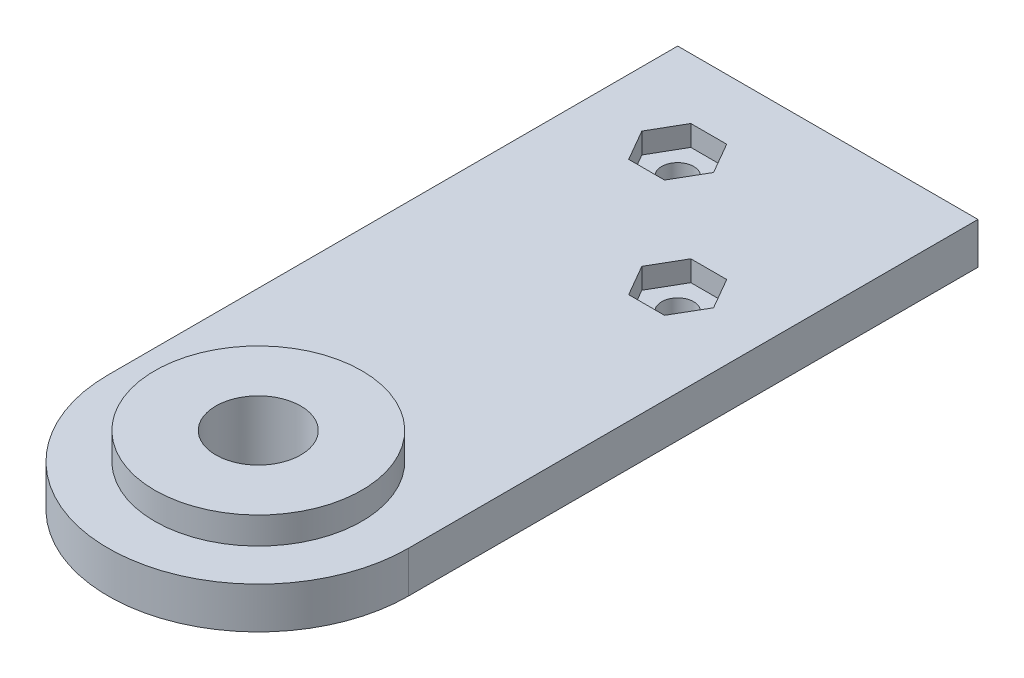
ISO-10303-21;
HEADER;
FILE_DESCRIPTION(('STEP AP214'),'2;1');
FILE_NAME('part.step','',(''),(''),'','','');
FILE_SCHEMA(('AUTOMOTIVE_DESIGN { 1 0 10303 214 1 1 1 1 }'));
ENDSEC;
DATA;
#1=APPLICATION_CONTEXT('core data for automotive mechanical design processes');
#2=APPLICATION_PROTOCOL_DEFINITION('international standard','automotive_design',2000,#1);
#3=PRODUCT_CONTEXT('',#1,'mechanical');
#4=PRODUCT('Part','Part','',(#3));
#5=PRODUCT_RELATED_PRODUCT_CATEGORY('part','',(#4));
#6=PRODUCT_DEFINITION_FORMATION('','',#4);
#7=PRODUCT_DEFINITION_CONTEXT('part definition',#1,'design');
#8=PRODUCT_DEFINITION('design','',#6,#7);
#9=PRODUCT_DEFINITION_SHAPE('','',#8);
#10=(LENGTH_UNIT() NAMED_UNIT(*) SI_UNIT(.MILLI.,.METRE.));
#11=(NAMED_UNIT(*) PLANE_ANGLE_UNIT() SI_UNIT($,.RADIAN.));
#12=(NAMED_UNIT(*) SI_UNIT($,.STERADIAN.) SOLID_ANGLE_UNIT());
#13=UNCERTAINTY_MEASURE_WITH_UNIT(LENGTH_MEASURE(1.E-05),#10,'distance_accuracy_value','');
#14=(GEOMETRIC_REPRESENTATION_CONTEXT(3) GLOBAL_UNCERTAINTY_ASSIGNED_CONTEXT((#13)) GLOBAL_UNIT_ASSIGNED_CONTEXT((#10,
#11,#12)) REPRESENTATION_CONTEXT('',''));
#15=CARTESIAN_POINT('',(0.,0.,0.));
#16=DIRECTION('',(0.,0.,1.));
#17=DIRECTION('',(1.,0.,0.));
#18=AXIS2_PLACEMENT_3D('',#15,#16,#17);
#19=CARTESIAN_POINT('',(-15.4656640467995,-4.38406204335664,11.6526094271965));
#20=DIRECTION('',(0.,1.,0.));
#21=DIRECTION('',(0.,0.,1.));
#22=AXIS2_PLACEMENT_3D('',#19,#20,#21);
#23=CYLINDRICAL_SURFACE('',#22,1.55000000000002);
#24=CARTESIAN_POINT('',(-15.4656640467995,0.,11.6526094271965));
#25=DIRECTION('',(0.,1.,0.));
#26=DIRECTION('',(0.,0.,1.));
#27=AXIS2_PLACEMENT_3D('',#24,#25,#26);
#28=CIRCLE('',#27,1.55000000000002);
#29=CARTESIAN_POINT('',(-15.4656640467995,0.,13.2026094271965));
#30=VERTEX_POINT('',#29);
#31=EDGE_CURVE('E258',#30,#30,#28,.F.);
#32=ORIENTED_EDGE('',*,*,#31,.T.);
#33=EDGE_LOOP('',(#32));
#34=FACE_BOUND('',#33,.T.);
#35=CARTESIAN_POINT('',(-15.4656640467995,2.,11.6526094271965));
#36=DIRECTION('',(0.,1.,0.));
#37=DIRECTION('',(0.,0.,1.));
#38=AXIS2_PLACEMENT_3D('',#35,#36,#37);
#39=CIRCLE('',#38,1.55000000000002);
#40=CARTESIAN_POINT('',(-15.4656640467995,2.,13.2026094271965));
#41=VERTEX_POINT('',#40);
#42=EDGE_CURVE('E41',#41,#41,#39,.F.);
#43=ORIENTED_EDGE('',*,*,#42,.F.);
#44=EDGE_LOOP('',(#43));
#45=FACE_BOUND('',#44,.T.);
#46=ADVANCED_FACE('F37',(#34,#45),#23,.F.);
#47=CARTESIAN_POINT('',(-26.7793725457844,-4.38406204335664,0.338900928211843));
#48=DIRECTION('',(0.,1.,0.));
#49=DIRECTION('',(0.,0.,1.));
#50=AXIS2_PLACEMENT_3D('',#47,#48,#49);
#51=CYLINDRICAL_SURFACE('',#50,1.55);
#52=CARTESIAN_POINT('',(-26.7793725457844,0.,0.338900928211843));
#53=DIRECTION('',(0.,1.,0.));
#54=DIRECTION('',(0.,0.,1.));
#55=AXIS2_PLACEMENT_3D('',#52,#53,#54);
#56=CIRCLE('',#55,1.55);
#57=CARTESIAN_POINT('',(-26.7793725457844,0.,1.88890092821184));
#58=VERTEX_POINT('',#57);
#59=EDGE_CURVE('E254',#58,#58,#56,.F.);
#60=ORIENTED_EDGE('',*,*,#59,.T.);
#61=EDGE_LOOP('',(#60));
#62=FACE_BOUND('',#61,.T.);
#63=CARTESIAN_POINT('',(-26.7793725457844,2.,0.338900928211843));
#64=DIRECTION('',(0.,1.,0.));
#65=DIRECTION('',(0.,0.,1.));
#66=AXIS2_PLACEMENT_3D('',#63,#64,#65);
#67=CIRCLE('',#66,1.55);
#68=CARTESIAN_POINT('',(-26.7793725457844,2.,1.88890092821184));
#69=VERTEX_POINT('',#68);
#70=EDGE_CURVE('E201',#69,#69,#67,.F.);
#71=ORIENTED_EDGE('',*,*,#70,.F.);
#72=EDGE_LOOP('',(#71));
#73=FACE_BOUND('',#72,.T.);
#74=ADVANCED_FACE('F307',(#62,#73),#51,.F.);
#75=CARTESIAN_POINT('',(0.,4.,0.));
#76=DIRECTION('',(0.,1.,0.));
#77=DIRECTION('',(0.,0.,1.));
#78=AXIS2_PLACEMENT_3D('',#75,#76,#77);
#79=PLANE('',#78);
#80=DIRECTION('',(-0.5,0.,-0.866025403784439));
#81=VECTOR('',#80,1.);
#82=CARTESIAN_POINT('',(-23.3152709306466,4.,0.338900928211843));
#83=LINE('',#82,#81);
#84=CARTESIAN_POINT('',(-23.3152709306466,4.,0.338900928211843));
#85=VERTEX_POINT('',#84);
#86=CARTESIAN_POINT('',(-25.0473217382155,4.,-2.66109907178816));
#87=VERTEX_POINT('',#86);
#88=EDGE_CURVE('E54',#85,#87,#83,.T.);
#89=ORIENTED_EDGE('',*,*,#88,.F.);
#90=DIRECTION('',(0.5,0.,-0.866025403784439));
#91=VECTOR('',#90,1.);
#92=CARTESIAN_POINT('',(-25.0473217382155,4.,3.33890092821184));
#93=LINE('',#92,#91);
#94=CARTESIAN_POINT('',(-25.0473217382155,4.,3.33890092821184));
#95=VERTEX_POINT('',#94);
#96=EDGE_CURVE('E174',#95,#85,#93,.T.);
#97=ORIENTED_EDGE('',*,*,#96,.F.);
#98=DIRECTION('',(1.,0.,0.));
#99=VECTOR('',#98,1.);
#100=CARTESIAN_POINT('',(-28.5114233533533,4.,3.33890092821184));
#101=LINE('',#100,#99);
#102=CARTESIAN_POINT('',(-28.5114233533533,4.,3.33890092821184));
#103=VERTEX_POINT('',#102);
#104=EDGE_CURVE('E177',#103,#95,#101,.T.);
#105=ORIENTED_EDGE('',*,*,#104,.F.);
#106=DIRECTION('',(0.500000000000001,0.,0.866025403784438));
#107=VECTOR('',#106,1.);
#108=CARTESIAN_POINT('',(-30.2434741609221,4.,0.338900928211845));
#109=LINE('',#108,#107);
#110=CARTESIAN_POINT('',(-30.2434741609221,4.,0.338900928211845));
#111=VERTEX_POINT('',#110);
#112=EDGE_CURVE('E194',#111,#103,#109,.T.);
#113=ORIENTED_EDGE('',*,*,#112,.F.);
#114=DIRECTION('',(-0.5,0.,0.866025403784439));
#115=VECTOR('',#114,1.);
#116=CARTESIAN_POINT('',(-28.5114233533533,4.,-2.66109907178816));
#117=LINE('',#116,#115);
#118=CARTESIAN_POINT('',(-28.5114233533533,4.,-2.66109907178816));
#119=VERTEX_POINT('',#118);
#120=EDGE_CURVE('E191',#119,#111,#117,.T.);
#121=ORIENTED_EDGE('',*,*,#120,.F.);
#122=DIRECTION('',(-1.,0.,0.));
#123=VECTOR('',#122,1.);
#124=CARTESIAN_POINT('',(-25.0473217382155,4.,-2.66109907178816));
#125=LINE('',#124,#123);
#126=EDGE_CURVE('E188',#87,#119,#125,.T.);
#127=ORIENTED_EDGE('',*,*,#126,.F.);
#128=EDGE_LOOP('',(#89,#97,#105,#113,#121,#127));
#129=FACE_BOUND('',#128,.T.);
#130=DIRECTION('',(-0.5,0.,-0.866025403784439));
#131=VECTOR('',#130,1.);
#132=CARTESIAN_POINT('',(-12.0015624316617,4.,11.6526094271965));
#133=LINE('',#132,#131);
#134=CARTESIAN_POINT('',(-12.0015624316617,4.,11.6526094271965));
#135=VERTEX_POINT('',#134);
#136=CARTESIAN_POINT('',(-13.7336132392306,4.,8.65260942719646));
#137=VERTEX_POINT('',#136);
#138=EDGE_CURVE('E62',#135,#137,#133,.T.);
#139=ORIENTED_EDGE('',*,*,#138,.F.);
#140=DIRECTION('',(0.5,0.,-0.866025403784439));
#141=VECTOR('',#140,1.);
#142=CARTESIAN_POINT('',(-13.7336132392306,4.,14.6526094271965));
#143=LINE('',#142,#141);
#144=CARTESIAN_POINT('',(-13.7336132392306,4.,14.6526094271965));
#145=VERTEX_POINT('',#144);
#146=EDGE_CURVE('E213',#145,#135,#143,.T.);
#147=ORIENTED_EDGE('',*,*,#146,.F.);
#148=DIRECTION('',(1.,0.,0.));
#149=VECTOR('',#148,1.);
#150=CARTESIAN_POINT('',(-17.1977148543684,4.,14.6526094271965));
#151=LINE('',#150,#149);
#152=CARTESIAN_POINT('',(-17.1977148543684,4.,14.6526094271965));
#153=VERTEX_POINT('',#152);
#154=EDGE_CURVE('E239',#153,#145,#151,.T.);
#155=ORIENTED_EDGE('',*,*,#154,.F.);
#156=DIRECTION('',(0.5,0.,0.866025403784438));
#157=VECTOR('',#156,1.);
#158=CARTESIAN_POINT('',(-18.9297656619372,4.,11.6526094271965));
#159=LINE('',#158,#157);
#160=CARTESIAN_POINT('',(-18.9297656619372,4.,11.6526094271965));
#161=VERTEX_POINT('',#160);
#162=EDGE_CURVE('E236',#161,#153,#159,.T.);
#163=ORIENTED_EDGE('',*,*,#162,.F.);
#164=DIRECTION('',(-0.5,0.,0.866025403784439));
#165=VECTOR('',#164,1.);
#166=CARTESIAN_POINT('',(-17.1977148543684,4.,8.65260942719646));
#167=LINE('',#166,#165);
#168=CARTESIAN_POINT('',(-17.1977148543684,4.,8.65260942719646));
#169=VERTEX_POINT('',#168);
#170=EDGE_CURVE('E233',#169,#161,#167,.T.);
#171=ORIENTED_EDGE('',*,*,#170,.F.);
#172=DIRECTION('',(-1.,0.,0.));
#173=VECTOR('',#172,1.);
#174=CARTESIAN_POINT('',(-13.7336132392306,4.,8.65260942719646));
#175=LINE('',#174,#173);
#176=EDGE_CURVE('E230',#137,#169,#175,.T.);
#177=ORIENTED_EDGE('',*,*,#176,.F.);
#178=EDGE_LOOP('',(#139,#147,#155,#163,#171,#177));
#179=FACE_BOUND('',#178,.T.);
#180=CARTESIAN_POINT('',(-21.1225182962919,4.,46.4957551777045));
#181=DIRECTION('',(0.,1.,0.));
#182=DIRECTION('',(0.,0.,1.));
#183=AXIS2_PLACEMENT_3D('',#180,#181,#182);
#184=CIRCLE('',#183,10.);
#185=CARTESIAN_POINT('',(-21.1225182962919,4.,56.4957551777045));
#186=VERTEX_POINT('',#185);
#187=EDGE_CURVE('E295',#186,#186,#184,.T.);
#188=ORIENTED_EDGE('',*,*,#187,.F.);
#189=EDGE_LOOP('',(#188));
#190=FACE_BOUND('',#189,.T.);
#191=CARTESIAN_POINT('',(-21.1225182962919,4.,46.4957551777045));
#192=DIRECTION('',(0.,1.,0.));
#193=DIRECTION('',(0.,0.,1.));
#194=AXIS2_PLACEMENT_3D('',#191,#192,#193);
#195=CIRCLE('',#194,14.5);
#196=CARTESIAN_POINT('',(-6.62251829629193,4.,46.4957551777045));
#197=VERTEX_POINT('',#196);
#198=CARTESIAN_POINT('',(-35.6225182962919,4.,46.4957551777045));
#199=VERTEX_POINT('',#198);
#200=EDGE_CURVE('E283',#197,#199,#195,.F.);
#201=ORIENTED_EDGE('',*,*,#200,.F.);
#202=DIRECTION('',(0.,0.,1.));
#203=VECTOR('',#202,1.);
#204=CARTESIAN_POINT('',(-6.62251829629193,4.,21.4957551777045));
#205=LINE('',#204,#203);
#206=CARTESIAN_POINT('',(-6.62251829629193,4.,-8.50424482229549));
#207=VERTEX_POINT('',#206);
#208=EDGE_CURVE('E280',#207,#197,#205,.T.);
#209=ORIENTED_EDGE('',*,*,#208,.F.);
#210=DIRECTION('',(1.,0.,0.));
#211=VECTOR('',#210,1.);
#212=CARTESIAN_POINT('',(-35.6225182962919,4.,-8.50424482229549));
#213=LINE('',#212,#211);
#214=CARTESIAN_POINT('',(-35.6225182962919,4.,-8.50424482229549));
#215=VERTEX_POINT('',#214);
#216=EDGE_CURVE('E257',#215,#207,#213,.T.);
#217=ORIENTED_EDGE('',*,*,#216,.F.);
#218=DIRECTION('',(0.,0.,-1.));
#219=VECTOR('',#218,1.);
#220=CARTESIAN_POINT('',(-35.6225182962919,4.,46.4957551777045));
#221=LINE('',#220,#219);
#222=EDGE_CURVE('E286',#199,#215,#221,.T.);
#223=ORIENTED_EDGE('',*,*,#222,.F.);
#224=EDGE_LOOP('',(#201,#209,#217,#223));
#225=FACE_BOUND('',#224,.T.);
#226=ADVANCED_FACE('F313',(#129,#179,#190,#225),#79,.T.);
#227=CARTESIAN_POINT('',(0.,0.,0.));
#228=DIRECTION('',(0.,1.,0.));
#229=DIRECTION('',(0.,0.,1.));
#230=AXIS2_PLACEMENT_3D('',#227,#228,#229);
#231=PLANE('',#230);
#232=ORIENTED_EDGE('',*,*,#59,.F.);
#233=EDGE_LOOP('',(#232));
#234=FACE_BOUND('',#233,.T.);
#235=ORIENTED_EDGE('',*,*,#31,.F.);
#236=EDGE_LOOP('',(#235));
#237=FACE_BOUND('',#236,.T.);
#238=CARTESIAN_POINT('',(-21.1225182962919,0.,46.4957551777045));
#239=DIRECTION('',(0.,-1.,0.));
#240=DIRECTION('',(0.,0.,-1.));
#241=AXIS2_PLACEMENT_3D('',#238,#239,#240);
#242=CIRCLE('',#241,4.1);
#243=CARTESIAN_POINT('',(-21.1225182962919,0.,42.3957551777045));
#244=VERTEX_POINT('',#243);
#245=EDGE_CURVE('E12',#244,#244,#242,.T.);
#246=ORIENTED_EDGE('',*,*,#245,.F.);
#247=EDGE_LOOP('',(#246));
#248=FACE_BOUND('',#247,.T.);
#249=DIRECTION('',(0.,0.,1.));
#250=VECTOR('',#249,1.);
#251=CARTESIAN_POINT('',(-6.62251829629193,0.,21.4957551777045));
#252=LINE('',#251,#250);
#253=CARTESIAN_POINT('',(-6.62251829629193,0.,-8.50424482229549));
#254=VERTEX_POINT('',#253);
#255=CARTESIAN_POINT('',(-6.62251829629193,0.,46.4957551777045));
#256=VERTEX_POINT('',#255);
#257=EDGE_CURVE('E273',#254,#256,#252,.T.);
#258=ORIENTED_EDGE('',*,*,#257,.T.);
#259=CARTESIAN_POINT('',(-21.1225182962919,0.,46.4957551777045));
#260=DIRECTION('',(0.,-1.,0.));
#261=DIRECTION('',(0.,0.,-1.));
#262=AXIS2_PLACEMENT_3D('',#259,#260,#261);
#263=CIRCLE('',#262,14.5);
#264=CARTESIAN_POINT('',(-35.6225182962919,0.,46.4957551777045));
#265=VERTEX_POINT('',#264);
#266=EDGE_CURVE('E277',#256,#265,#263,.T.);
#267=ORIENTED_EDGE('',*,*,#266,.T.);
#268=DIRECTION('',(0.,0.,-1.));
#269=VECTOR('',#268,1.);
#270=CARTESIAN_POINT('',(-35.6225182962919,0.,46.4957551777045));
#271=LINE('',#270,#269);
#272=CARTESIAN_POINT('',(-35.6225182962919,0.,-8.50424482229549));
#273=VERTEX_POINT('',#272);
#274=EDGE_CURVE('E278',#265,#273,#271,.T.);
#275=ORIENTED_EDGE('',*,*,#274,.T.);
#276=DIRECTION('',(-1.,0.,0.));
#277=VECTOR('',#276,1.);
#278=CARTESIAN_POINT('',(-6.62251829629193,0.,-8.50424482229549));
#279=LINE('',#278,#277);
#280=EDGE_CURVE('E266',#254,#273,#279,.T.);
#281=ORIENTED_EDGE('',*,*,#280,.F.);
#282=EDGE_LOOP('',(#258,#267,#275,#281));
#283=FACE_BOUND('',#282,.T.);
#284=ADVANCED_FACE('F39',(#234,#237,#248,#283),#231,.F.);
#285=CARTESIAN_POINT('',(-21.1225182962919,15.5965512114594,46.4957551777045));
#286=DIRECTION('',(0.,-1.,0.));
#287=DIRECTION('',(0.,0.,-1.));
#288=AXIS2_PLACEMENT_3D('',#285,#286,#287);
#289=CYLINDRICAL_SURFACE('',#288,4.1);
#290=ORIENTED_EDGE('',*,*,#245,.T.);
#291=EDGE_LOOP('',(#290));
#292=FACE_BOUND('',#291,.T.);
#293=CARTESIAN_POINT('',(-21.1225182962919,6.6,46.4957551777045));
#294=DIRECTION('',(0.,1.,0.));
#295=DIRECTION('',(0.,0.,1.));
#296=AXIS2_PLACEMENT_3D('',#293,#294,#295);
#297=CIRCLE('',#296,4.1);
#298=CARTESIAN_POINT('',(-21.1225182962919,6.6,50.5957551777045));
#299=VERTEX_POINT('',#298);
#300=EDGE_CURVE('E290',#299,#299,#297,.T.);
#301=ORIENTED_EDGE('',*,*,#300,.T.);
#302=EDGE_LOOP('',(#301));
#303=FACE_BOUND('',#302,.T.);
#304=ADVANCED_FACE('F338',(#292,#303),#289,.F.);
#305=CARTESIAN_POINT('',(-21.1225182962919,6.6,46.4957551777045));
#306=DIRECTION('',(0.,1.,0.));
#307=DIRECTION('',(0.,0.,1.));
#308=AXIS2_PLACEMENT_3D('',#305,#306,#307);
#309=PLANE('',#308);
#310=CARTESIAN_POINT('',(-21.1225182962919,6.6,46.4957551777045));
#311=DIRECTION('',(0.,1.,0.));
#312=DIRECTION('',(0.,0.,1.));
#313=AXIS2_PLACEMENT_3D('',#310,#311,#312);
#314=CIRCLE('',#313,10.);
#315=CARTESIAN_POINT('',(-21.1225182962919,6.6,56.4957551777045));
#316=VERTEX_POINT('',#315);
#317=EDGE_CURVE('E46',#316,#316,#314,.T.);
#318=ORIENTED_EDGE('',*,*,#317,.T.);
#319=EDGE_LOOP('',(#318));
#320=FACE_BOUND('',#319,.T.);
#321=ORIENTED_EDGE('',*,*,#300,.F.);
#322=EDGE_LOOP('',(#321));
#323=FACE_BOUND('',#322,.T.);
#324=ADVANCED_FACE('F335',(#320,#323),#309,.T.);
#325=CARTESIAN_POINT('',(-21.1225182962919,6.6,46.4957551777045));
#326=DIRECTION('',(0.,-1.,0.));
#327=DIRECTION('',(0.,0.,-1.));
#328=AXIS2_PLACEMENT_3D('',#325,#326,#327);
#329=CYLINDRICAL_SURFACE('',#328,10.);
#330=ORIENTED_EDGE('',*,*,#317,.F.);
#331=EDGE_LOOP('',(#330));
#332=FACE_BOUND('',#331,.T.);
#333=ORIENTED_EDGE('',*,*,#187,.T.);
#334=EDGE_LOOP('',(#333));
#335=FACE_BOUND('',#334,.T.);
#336=ADVANCED_FACE('F333',(#332,#335),#329,.T.);
#337=CARTESIAN_POINT('',(-21.1225182962919,75.4177848998413,46.4957551777045));
#338=DIRECTION('',(0.,-1.,0.));
#339=DIRECTION('',(0.,0.,-1.));
#340=AXIS2_PLACEMENT_3D('',#337,#338,#339);
#341=CYLINDRICAL_SURFACE('',#340,14.5);
#342=ORIENTED_EDGE('',*,*,#200,.T.);
#343=DIRECTION('',(0.,-1.,0.));
#344=VECTOR('',#343,1.);
#345=CARTESIAN_POINT('',(-35.6225182962919,75.4177848998413,46.4957551777045));
#346=LINE('',#345,#344);
#347=EDGE_CURVE('E276',#199,#265,#346,.T.);
#348=ORIENTED_EDGE('',*,*,#347,.T.);
#349=ORIENTED_EDGE('',*,*,#266,.F.);
#350=DIRECTION('',(0.,-1.,0.));
#351=VECTOR('',#350,1.);
#352=CARTESIAN_POINT('',(-6.62251829629193,75.4177848998413,46.4957551777045));
#353=LINE('',#352,#351);
#354=EDGE_CURVE('E272',#197,#256,#353,.T.);
#355=ORIENTED_EDGE('',*,*,#354,.F.);
#356=EDGE_LOOP('',(#342,#348,#349,#355));
#357=FACE_BOUND('',#356,.T.);
#358=ADVANCED_FACE('F329',(#357),#341,.T.);
#359=CARTESIAN_POINT('',(-6.62251829629193,75.4177848998413,21.4957551777045));
#360=DIRECTION('',(1.,0.,0.));
#361=DIRECTION('',(0.,0.,-1.));
#362=AXIS2_PLACEMENT_3D('',#359,#360,#361);
#363=PLANE('',#362);
#364=ORIENTED_EDGE('',*,*,#208,.T.);
#365=ORIENTED_EDGE('',*,*,#354,.T.);
#366=ORIENTED_EDGE('',*,*,#257,.F.);
#367=DIRECTION('',(0.,-1.,0.));
#368=VECTOR('',#367,1.);
#369=CARTESIAN_POINT('',(-6.62251829629193,4.,-8.50424482229549));
#370=LINE('',#369,#368);
#371=EDGE_CURVE('E263',#207,#254,#370,.T.);
#372=ORIENTED_EDGE('',*,*,#371,.F.);
#373=EDGE_LOOP('',(#364,#365,#366,#372));
#374=FACE_BOUND('',#373,.T.);
#375=ADVANCED_FACE('F325',(#374),#363,.T.);
#376=CARTESIAN_POINT('',(-35.6225182962919,75.4177848998413,46.4957551777045));
#377=DIRECTION('',(-1.,0.,0.));
#378=DIRECTION('',(0.,0.,1.));
#379=AXIS2_PLACEMENT_3D('',#376,#377,#378);
#380=PLANE('',#379);
#381=ORIENTED_EDGE('',*,*,#222,.T.);
#382=DIRECTION('',(0.,1.,0.));
#383=VECTOR('',#382,1.);
#384=CARTESIAN_POINT('',(-35.6225182962919,0.,-8.50424482229549));
#385=LINE('',#384,#383);
#386=EDGE_CURVE('E269',#273,#215,#385,.T.);
#387=ORIENTED_EDGE('',*,*,#386,.F.);
#388=ORIENTED_EDGE('',*,*,#274,.F.);
#389=ORIENTED_EDGE('',*,*,#347,.F.);
#390=EDGE_LOOP('',(#381,#387,#388,#389));
#391=FACE_BOUND('',#390,.T.);
#392=ADVANCED_FACE('F321',(#391),#380,.T.);
#393=CARTESIAN_POINT('',(0.,0.,-8.50424482229549));
#394=DIRECTION('',(0.,0.,-1.));
#395=DIRECTION('',(-1.,0.,0.));
#396=AXIS2_PLACEMENT_3D('',#393,#394,#395);
#397=PLANE('',#396);
#398=ORIENTED_EDGE('',*,*,#216,.T.);
#399=ORIENTED_EDGE('',*,*,#371,.T.);
#400=ORIENTED_EDGE('',*,*,#280,.T.);
#401=ORIENTED_EDGE('',*,*,#386,.T.);
#402=EDGE_LOOP('',(#398,#399,#400,#401));
#403=FACE_BOUND('',#402,.T.);
#404=ADVANCED_FACE('F318',(#403),#397,.T.);
#405=CARTESIAN_POINT('',(0.,2.,0.));
#406=DIRECTION('',(0.,1.,0.));
#407=DIRECTION('',(0.,0.,1.));
#408=AXIS2_PLACEMENT_3D('',#405,#406,#407);
#409=PLANE('',#408);
#410=DIRECTION('',(-0.5,0.,-0.866025403784439));
#411=VECTOR('',#410,1.);
#412=CARTESIAN_POINT('',(-23.3152709306466,2.,0.338900928211843));
#413=LINE('',#412,#411);
#414=CARTESIAN_POINT('',(-23.3152709306466,2.,0.338900928211843));
#415=VERTEX_POINT('',#414);
#416=CARTESIAN_POINT('',(-25.0473217382155,2.,-2.66109907178816));
#417=VERTEX_POINT('',#416);
#418=EDGE_CURVE('E154',#415,#417,#413,.T.);
#419=ORIENTED_EDGE('',*,*,#418,.T.);
#420=DIRECTION('',(-1.,0.,0.));
#421=VECTOR('',#420,1.);
#422=CARTESIAN_POINT('',(-25.0473217382155,2.,-2.66109907178816));
#423=LINE('',#422,#421);
#424=CARTESIAN_POINT('',(-28.5114233533533,2.,-2.66109907178816));
#425=VERTEX_POINT('',#424);
#426=EDGE_CURVE('E163',#417,#425,#423,.T.);
#427=ORIENTED_EDGE('',*,*,#426,.T.);
#428=DIRECTION('',(-0.5,0.,0.866025403784439));
#429=VECTOR('',#428,1.);
#430=CARTESIAN_POINT('',(-28.5114233533533,2.,-2.66109907178816));
#431=LINE('',#430,#429);
#432=CARTESIAN_POINT('',(-30.2434741609221,2.,0.338900928211845));
#433=VERTEX_POINT('',#432);
#434=EDGE_CURVE('E168',#425,#433,#431,.T.);
#435=ORIENTED_EDGE('',*,*,#434,.T.);
#436=DIRECTION('',(0.500000000000001,0.,0.866025403784438));
#437=VECTOR('',#436,1.);
#438=CARTESIAN_POINT('',(-30.2434741609221,2.,0.338900928211845));
#439=LINE('',#438,#437);
#440=CARTESIAN_POINT('',(-28.5114233533533,2.,3.33890092821184));
#441=VERTEX_POINT('',#440);
#442=EDGE_CURVE('E181',#433,#441,#439,.T.);
#443=ORIENTED_EDGE('',*,*,#442,.T.);
#444=DIRECTION('',(1.,0.,0.));
#445=VECTOR('',#444,1.);
#446=CARTESIAN_POINT('',(-28.5114233533533,2.,3.33890092821184));
#447=LINE('',#446,#445);
#448=CARTESIAN_POINT('',(-25.0473217382155,2.,3.33890092821184));
#449=VERTEX_POINT('',#448);
#450=EDGE_CURVE('E184',#441,#449,#447,.T.);
#451=ORIENTED_EDGE('',*,*,#450,.T.);
#452=DIRECTION('',(0.5,0.,-0.866025403784439));
#453=VECTOR('',#452,1.);
#454=CARTESIAN_POINT('',(-25.0473217382155,2.,3.33890092821184));
#455=LINE('',#454,#453);
#456=EDGE_CURVE('E160',#449,#415,#455,.T.);
#457=ORIENTED_EDGE('',*,*,#456,.T.);
#458=EDGE_LOOP('',(#419,#427,#435,#443,#451,#457));
#459=FACE_BOUND('',#458,.T.);
#460=ORIENTED_EDGE('',*,*,#70,.T.);
#461=EDGE_LOOP('',(#460));
#462=FACE_BOUND('',#461,.T.);
#463=ADVANCED_FACE('F170',(#459,#462),#409,.T.);
#464=CARTESIAN_POINT('',(-23.3152709306466,2.,0.338900928211843));
#465=DIRECTION('',(0.866025403784439,0.,-0.5));
#466=DIRECTION('',(-0.5,0.,-0.866025403784439));
#467=AXIS2_PLACEMENT_3D('',#464,#465,#466);
#468=PLANE('',#467);
#469=ORIENTED_EDGE('',*,*,#88,.T.);
#470=DIRECTION('',(0.,1.,0.));
#471=VECTOR('',#470,1.);
#472=CARTESIAN_POINT('',(-25.0473217382155,2.,-2.66109907178816));
#473=LINE('',#472,#471);
#474=EDGE_CURVE('E150',#417,#87,#473,.T.);
#475=ORIENTED_EDGE('',*,*,#474,.F.);
#476=ORIENTED_EDGE('',*,*,#418,.F.);
#477=DIRECTION('',(0.,1.,0.));
#478=VECTOR('',#477,1.);
#479=CARTESIAN_POINT('',(-23.3152709306466,2.,0.338900928211843));
#480=LINE('',#479,#478);
#481=EDGE_CURVE('E199',#415,#85,#480,.T.);
#482=ORIENTED_EDGE('',*,*,#481,.T.);
#483=EDGE_LOOP('',(#469,#475,#476,#482));
#484=FACE_BOUND('',#483,.T.);
#485=ADVANCED_FACE('F152',(#484),#468,.F.);
#486=CARTESIAN_POINT('',(-25.0473217382155,2.,3.33890092821184));
#487=DIRECTION('',(0.866025403784439,0.,0.5));
#488=DIRECTION('',(0.5,0.,-0.866025403784439));
#489=AXIS2_PLACEMENT_3D('',#486,#487,#488);
#490=PLANE('',#489);
#491=ORIENTED_EDGE('',*,*,#96,.T.);
#492=ORIENTED_EDGE('',*,*,#481,.F.);
#493=ORIENTED_EDGE('',*,*,#456,.F.);
#494=DIRECTION('',(0.,1.,0.));
#495=VECTOR('',#494,1.);
#496=CARTESIAN_POINT('',(-25.0473217382155,2.,3.33890092821184));
#497=LINE('',#496,#495);
#498=EDGE_CURVE('E202',#449,#95,#497,.T.);
#499=ORIENTED_EDGE('',*,*,#498,.T.);
#500=EDGE_LOOP('',(#491,#492,#493,#499));
#501=FACE_BOUND('',#500,.T.);
#502=ADVANCED_FACE('F477',(#501),#490,.F.);
#503=CARTESIAN_POINT('',(-28.5114233533533,2.,3.33890092821184));
#504=DIRECTION('',(0.,0.,1.));
#505=DIRECTION('',(1.,0.,0.));
#506=AXIS2_PLACEMENT_3D('',#503,#504,#505);
#507=PLANE('',#506);
#508=ORIENTED_EDGE('',*,*,#104,.T.);
#509=ORIENTED_EDGE('',*,*,#498,.F.);
#510=ORIENTED_EDGE('',*,*,#450,.F.);
#511=DIRECTION('',(0.,1.,0.));
#512=VECTOR('',#511,1.);
#513=CARTESIAN_POINT('',(-28.5114233533533,2.,3.33890092821184));
#514=LINE('',#513,#512);
#515=EDGE_CURVE('E204',#441,#103,#514,.T.);
#516=ORIENTED_EDGE('',*,*,#515,.T.);
#517=EDGE_LOOP('',(#508,#509,#510,#516));
#518=FACE_BOUND('',#517,.T.);
#519=ADVANCED_FACE('F468',(#518),#507,.F.);
#520=CARTESIAN_POINT('',(-30.2434741609221,2.,0.338900928211845));
#521=DIRECTION('',(-0.866025403784438,0.,0.500000000000001));
#522=DIRECTION('',(0.500000000000001,0.,0.866025403784438));
#523=AXIS2_PLACEMENT_3D('',#520,#521,#522);
#524=PLANE('',#523);
#525=ORIENTED_EDGE('',*,*,#112,.T.);
#526=ORIENTED_EDGE('',*,*,#515,.F.);
#527=ORIENTED_EDGE('',*,*,#442,.F.);
#528=DIRECTION('',(0.,1.,0.));
#529=VECTOR('',#528,1.);
#530=CARTESIAN_POINT('',(-30.2434741609221,2.,0.338900928211845));
#531=LINE('',#530,#529);
#532=EDGE_CURVE('E206',#433,#111,#531,.T.);
#533=ORIENTED_EDGE('',*,*,#532,.T.);
#534=EDGE_LOOP('',(#525,#526,#527,#533));
#535=FACE_BOUND('',#534,.T.);
#536=ADVANCED_FACE('F459',(#535),#524,.F.);
#537=CARTESIAN_POINT('',(-28.5114233533533,2.,-2.66109907178816));
#538=DIRECTION('',(-0.866025403784439,0.,-0.5));
#539=DIRECTION('',(-0.5,0.,0.866025403784439));
#540=AXIS2_PLACEMENT_3D('',#537,#538,#539);
#541=PLANE('',#540);
#542=ORIENTED_EDGE('',*,*,#120,.T.);
#543=ORIENTED_EDGE('',*,*,#532,.F.);
#544=ORIENTED_EDGE('',*,*,#434,.F.);
#545=DIRECTION('',(0.,1.,0.));
#546=VECTOR('',#545,1.);
#547=CARTESIAN_POINT('',(-28.5114233533533,2.,-2.66109907178816));
#548=LINE('',#547,#546);
#549=EDGE_CURVE('E159',#425,#119,#548,.T.);
#550=ORIENTED_EDGE('',*,*,#549,.T.);
#551=EDGE_LOOP('',(#542,#543,#544,#550));
#552=FACE_BOUND('',#551,.T.);
#553=ADVANCED_FACE('F408',(#552),#541,.F.);
#554=CARTESIAN_POINT('',(-25.0473217382155,2.,-2.66109907178816));
#555=DIRECTION('',(0.,0.,-1.));
#556=DIRECTION('',(-1.,0.,0.));
#557=AXIS2_PLACEMENT_3D('',#554,#555,#556);
#558=PLANE('',#557);
#559=ORIENTED_EDGE('',*,*,#126,.T.);
#560=ORIENTED_EDGE('',*,*,#549,.F.);
#561=ORIENTED_EDGE('',*,*,#426,.F.);
#562=ORIENTED_EDGE('',*,*,#474,.T.);
#563=EDGE_LOOP('',(#559,#560,#561,#562));
#564=FACE_BOUND('',#563,.T.);
#565=ADVANCED_FACE('F164',(#564),#558,.F.);
#566=CARTESIAN_POINT('',(0.,2.,0.));
#567=DIRECTION('',(0.,1.,0.));
#568=DIRECTION('',(0.,0.,1.));
#569=AXIS2_PLACEMENT_3D('',#566,#567,#568);
#570=PLANE('',#569);
#571=DIRECTION('',(-0.5,0.,-0.866025403784439));
#572=VECTOR('',#571,1.);
#573=CARTESIAN_POINT('',(-12.0015624316617,2.,11.6526094271965));
#574=LINE('',#573,#572);
#575=CARTESIAN_POINT('',(-12.0015624316617,2.,11.6526094271965));
#576=VERTEX_POINT('',#575);
#577=CARTESIAN_POINT('',(-13.7336132392306,2.,8.65260942719646));
#578=VERTEX_POINT('',#577);
#579=EDGE_CURVE('E209',#576,#578,#574,.T.);
#580=ORIENTED_EDGE('',*,*,#579,.T.);
#581=DIRECTION('',(-1.,0.,0.));
#582=VECTOR('',#581,1.);
#583=CARTESIAN_POINT('',(-13.7336132392306,2.,8.65260942719646));
#584=LINE('',#583,#582);
#585=CARTESIAN_POINT('',(-17.1977148543684,2.,8.65260942719646));
#586=VERTEX_POINT('',#585);
#587=EDGE_CURVE('E212',#578,#586,#584,.T.);
#588=ORIENTED_EDGE('',*,*,#587,.T.);
#589=DIRECTION('',(-0.5,0.,0.866025403784439));
#590=VECTOR('',#589,1.);
#591=CARTESIAN_POINT('',(-17.1977148543684,2.,8.65260942719646));
#592=LINE('',#591,#590);
#593=CARTESIAN_POINT('',(-18.9297656619372,2.,11.6526094271965));
#594=VERTEX_POINT('',#593);
#595=EDGE_CURVE('E216',#586,#594,#592,.T.);
#596=ORIENTED_EDGE('',*,*,#595,.T.);
#597=DIRECTION('',(0.5,0.,0.866025403784438));
#598=VECTOR('',#597,1.);
#599=CARTESIAN_POINT('',(-18.9297656619372,2.,11.6526094271965));
#600=LINE('',#599,#598);
#601=CARTESIAN_POINT('',(-17.1977148543684,2.,14.6526094271965));
#602=VERTEX_POINT('',#601);
#603=EDGE_CURVE('E219',#594,#602,#600,.T.);
#604=ORIENTED_EDGE('',*,*,#603,.T.);
#605=DIRECTION('',(1.,0.,0.));
#606=VECTOR('',#605,1.);
#607=CARTESIAN_POINT('',(-17.1977148543684,2.,14.6526094271965));
#608=LINE('',#607,#606);
#609=CARTESIAN_POINT('',(-13.7336132392306,2.,14.6526094271965));
#610=VERTEX_POINT('',#609);
#611=EDGE_CURVE('E222',#602,#610,#608,.T.);
#612=ORIENTED_EDGE('',*,*,#611,.T.);
#613=DIRECTION('',(0.5,0.,-0.866025403784439));
#614=VECTOR('',#613,1.);
#615=CARTESIAN_POINT('',(-13.7336132392306,2.,14.6526094271965));
#616=LINE('',#615,#614);
#617=EDGE_CURVE('E225',#610,#576,#616,.T.);
#618=ORIENTED_EDGE('',*,*,#617,.T.);
#619=EDGE_LOOP('',(#580,#588,#596,#604,#612,#618));
#620=FACE_BOUND('',#619,.T.);
#621=ORIENTED_EDGE('',*,*,#42,.T.);
#622=EDGE_LOOP('',(#621));
#623=FACE_BOUND('',#622,.T.);
#624=ADVANCED_FACE('F304',(#620,#623),#570,.T.);
#625=CARTESIAN_POINT('',(-12.0015624316617,2.,11.6526094271965));
#626=DIRECTION('',(0.866025403784439,0.,-0.5));
#627=DIRECTION('',(-0.5,0.,-0.866025403784439));
#628=AXIS2_PLACEMENT_3D('',#625,#626,#627);
#629=PLANE('',#628);
#630=ORIENTED_EDGE('',*,*,#138,.T.);
#631=DIRECTION('',(0.,1.,0.));
#632=VECTOR('',#631,1.);
#633=CARTESIAN_POINT('',(-13.7336132392306,2.,8.65260942719646));
#634=LINE('',#633,#632);
#635=EDGE_CURVE('E228',#578,#137,#634,.T.);
#636=ORIENTED_EDGE('',*,*,#635,.F.);
#637=ORIENTED_EDGE('',*,*,#579,.F.);
#638=DIRECTION('',(0.,1.,0.));
#639=VECTOR('',#638,1.);
#640=CARTESIAN_POINT('',(-12.0015624316617,2.,11.6526094271965));
#641=LINE('',#640,#639);
#642=EDGE_CURVE('E189',#576,#135,#641,.T.);
#643=ORIENTED_EDGE('',*,*,#642,.T.);
#644=EDGE_LOOP('',(#630,#636,#637,#643));
#645=FACE_BOUND('',#644,.T.);
#646=ADVANCED_FACE('F376',(#645),#629,.F.);
#647=CARTESIAN_POINT('',(-13.7336132392306,2.,14.6526094271965));
#648=DIRECTION('',(0.866025403784439,0.,0.5));
#649=DIRECTION('',(0.5,0.,-0.866025403784439));
#650=AXIS2_PLACEMENT_3D('',#647,#648,#649);
#651=PLANE('',#650);
#652=ORIENTED_EDGE('',*,*,#146,.T.);
#653=ORIENTED_EDGE('',*,*,#642,.F.);
#654=ORIENTED_EDGE('',*,*,#617,.F.);
#655=DIRECTION('',(0.,1.,0.));
#656=VECTOR('',#655,1.);
#657=CARTESIAN_POINT('',(-13.7336132392306,2.,14.6526094271965));
#658=LINE('',#657,#656);
#659=EDGE_CURVE('E245',#610,#145,#658,.T.);
#660=ORIENTED_EDGE('',*,*,#659,.T.);
#661=EDGE_LOOP('',(#652,#653,#654,#660));
#662=FACE_BOUND('',#661,.T.);
#663=ADVANCED_FACE('F381',(#662),#651,.F.);
#664=CARTESIAN_POINT('',(-17.1977148543684,2.,14.6526094271965));
#665=DIRECTION('',(0.,0.,1.));
#666=DIRECTION('',(1.,0.,0.));
#667=AXIS2_PLACEMENT_3D('',#664,#665,#666);
#668=PLANE('',#667);
#669=ORIENTED_EDGE('',*,*,#154,.T.);
#670=ORIENTED_EDGE('',*,*,#659,.F.);
#671=ORIENTED_EDGE('',*,*,#611,.F.);
#672=DIRECTION('',(0.,1.,0.));
#673=VECTOR('',#672,1.);
#674=CARTESIAN_POINT('',(-17.1977148543684,2.,14.6526094271965));
#675=LINE('',#674,#673);
#676=EDGE_CURVE('E247',#602,#153,#675,.T.);
#677=ORIENTED_EDGE('',*,*,#676,.T.);
#678=EDGE_LOOP('',(#669,#670,#671,#677));
#679=FACE_BOUND('',#678,.T.);
#680=ADVANCED_FACE('F383',(#679),#668,.F.);
#681=CARTESIAN_POINT('',(-18.9297656619372,2.,11.6526094271965));
#682=DIRECTION('',(-0.866025403784439,0.,0.5));
#683=DIRECTION('',(0.5,0.,0.866025403784439));
#684=AXIS2_PLACEMENT_3D('',#681,#682,#683);
#685=PLANE('',#684);
#686=ORIENTED_EDGE('',*,*,#162,.T.);
#687=ORIENTED_EDGE('',*,*,#676,.F.);
#688=ORIENTED_EDGE('',*,*,#603,.F.);
#689=DIRECTION('',(0.,1.,0.));
#690=VECTOR('',#689,1.);
#691=CARTESIAN_POINT('',(-18.9297656619372,2.,11.6526094271965));
#692=LINE('',#691,#690);
#693=EDGE_CURVE('E249',#594,#161,#692,.T.);
#694=ORIENTED_EDGE('',*,*,#693,.T.);
#695=EDGE_LOOP('',(#686,#687,#688,#694));
#696=FACE_BOUND('',#695,.T.);
#697=ADVANCED_FACE('F385',(#696),#685,.F.);
#698=CARTESIAN_POINT('',(-17.1977148543684,2.,8.65260942719646));
#699=DIRECTION('',(-0.866025403784439,0.,-0.5));
#700=DIRECTION('',(-0.5,0.,0.866025403784439));
#701=AXIS2_PLACEMENT_3D('',#698,#699,#700);
#702=PLANE('',#701);
#703=ORIENTED_EDGE('',*,*,#170,.T.);
#704=ORIENTED_EDGE('',*,*,#693,.F.);
#705=ORIENTED_EDGE('',*,*,#595,.F.);
#706=DIRECTION('',(0.,1.,0.));
#707=VECTOR('',#706,1.);
#708=CARTESIAN_POINT('',(-17.1977148543684,2.,8.65260942719646));
#709=LINE('',#708,#707);
#710=EDGE_CURVE('E251',#586,#169,#709,.T.);
#711=ORIENTED_EDGE('',*,*,#710,.T.);
#712=EDGE_LOOP('',(#703,#704,#705,#711));
#713=FACE_BOUND('',#712,.T.);
#714=ADVANCED_FACE('F388',(#713),#702,.F.);
#715=CARTESIAN_POINT('',(-13.7336132392306,2.,8.65260942719646));
#716=DIRECTION('',(0.,0.,-1.));
#717=DIRECTION('',(-1.,0.,0.));
#718=AXIS2_PLACEMENT_3D('',#715,#716,#717);
#719=PLANE('',#718);
#720=ORIENTED_EDGE('',*,*,#176,.T.);
#721=ORIENTED_EDGE('',*,*,#710,.F.);
#722=ORIENTED_EDGE('',*,*,#587,.F.);
#723=ORIENTED_EDGE('',*,*,#635,.T.);
#724=EDGE_LOOP('',(#720,#721,#722,#723));
#725=FACE_BOUND('',#724,.T.);
#726=ADVANCED_FACE('F372',(#725),#719,.F.);
#727=CLOSED_SHELL('',(#46,#74,#226,#284,#304,#324,#336,#358,#375,#392,#404,#463,#485,#502,#519,
#536,#553,#565,#624,#646,#663,#680,#697,#714,#726));
#728=MANIFOLD_SOLID_BREP('B2',#727);
#729=ADVANCED_BREP_SHAPE_REPRESENTATION('',(#18,#728),#14);
#730=SHAPE_DEFINITION_REPRESENTATION(#9,#729);
ENDSEC;
END-ISO-10303-21;
